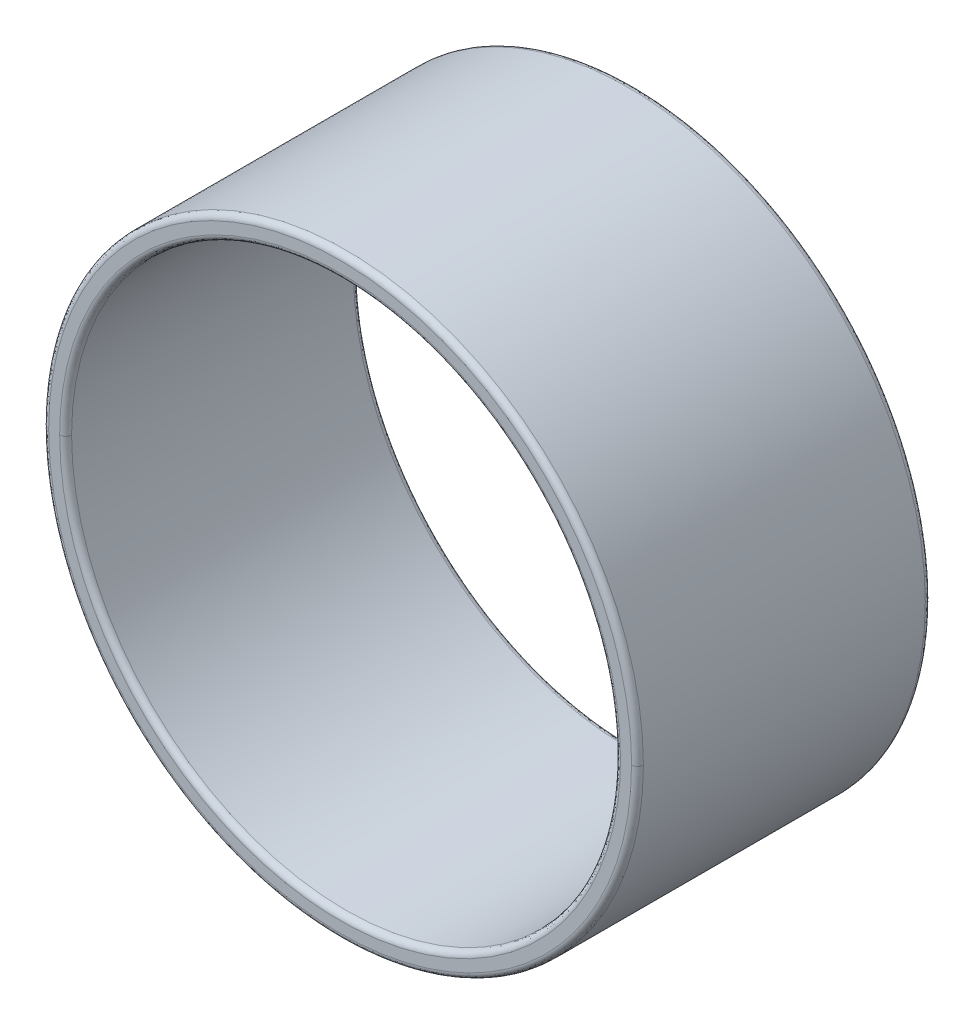
ISO-10303-21;
HEADER;
FILE_DESCRIPTION(('STEP AP214'),'2;1');
FILE_NAME('part.step','',(''),(''),'','','');
FILE_SCHEMA(('AUTOMOTIVE_DESIGN { 1 0 10303 214 1 1 1 1 }'));
ENDSEC;
DATA;
#1=APPLICATION_CONTEXT('core data for automotive mechanical design processes');
#2=APPLICATION_PROTOCOL_DEFINITION('international standard','automotive_design',2000,#1);
#3=PRODUCT_CONTEXT('',#1,'mechanical');
#4=PRODUCT('Part','Part','',(#3));
#5=PRODUCT_RELATED_PRODUCT_CATEGORY('part','',(#4));
#6=PRODUCT_DEFINITION_FORMATION('','',#4);
#7=PRODUCT_DEFINITION_CONTEXT('part definition',#1,'design');
#8=PRODUCT_DEFINITION('design','',#6,#7);
#9=PRODUCT_DEFINITION_SHAPE('','',#8);
#10=(LENGTH_UNIT() NAMED_UNIT(*) SI_UNIT(.MILLI.,.METRE.));
#11=(NAMED_UNIT(*) PLANE_ANGLE_UNIT() SI_UNIT($,.RADIAN.));
#12=(NAMED_UNIT(*) SI_UNIT($,.STERADIAN.) SOLID_ANGLE_UNIT());
#13=UNCERTAINTY_MEASURE_WITH_UNIT(LENGTH_MEASURE(1.E-05),#10,'distance_accuracy_value','');
#14=(GEOMETRIC_REPRESENTATION_CONTEXT(3) GLOBAL_UNCERTAINTY_ASSIGNED_CONTEXT((#13)) GLOBAL_UNIT_ASSIGNED_CONTEXT((#10,
#11,#12)) REPRESENTATION_CONTEXT('',''));
#15=CARTESIAN_POINT('',(0.,0.,0.));
#16=DIRECTION('',(0.,0.,1.));
#17=DIRECTION('',(1.,0.,0.));
#18=AXIS2_PLACEMENT_3D('',#15,#16,#17);
#19=CARTESIAN_POINT('',(38.104124071,0.,0.9079124844));
#20=CARTESIAN_POINT('',(38.104124071,-76.2082481166,0.9079124844));
#21=CARTESIAN_POINT('',(-38.104124071,-76.2082481166,0.9079124844));
#22=CARTESIAN_POINT('',(-38.104124071,0.,0.9079124844));
#23=CARTESIAN_POINT('',(38.0478115344,0.,0.3466656262));
#24=CARTESIAN_POINT('',(38.0478115344,-76.0956230942,0.3466656262));
#25=CARTESIAN_POINT('',(-38.0478115344,-76.0956230942,0.3466656262));
#26=CARTESIAN_POINT('',(-38.0478115344,0.,0.3466656262));
#27=CARTESIAN_POINT('',(38.4466656262,0.,-0.0521884656));
#28=CARTESIAN_POINT('',(38.4466656262,-76.893331227,-0.0521884656));
#29=CARTESIAN_POINT('',(-38.4466656262,-76.893331227,-0.0521884656));
#30=CARTESIAN_POINT('',(-38.4466656262,0.,-0.0521884656));
#31=CARTESIAN_POINT('',(39.0079124844,0.,0.004124071));
#32=CARTESIAN_POINT('',(39.0079124844,-78.0158249688,0.004124071));
#33=CARTESIAN_POINT('',(-39.0079124844,-78.0158249688,0.004124071));
#34=CARTESIAN_POINT('',(-39.0079124844,0.,0.004124071));
#35=(BOUNDED_SURFACE() B_SPLINE_SURFACE(3,3,((#19,#20,#21,#22),(#23,#24,#25,#26),(#27,#28,#29,
#30),(#31,#32,#33,#34)),.UNSPECIFIED.,.F.,.F.,.F.) B_SPLINE_SURFACE_WITH_KNOTS((4,4),(4,4),(0.,
1.),(0.,1.),.UNSPECIFIED.) GEOMETRIC_REPRESENTATION_ITEM() RATIONAL_B_SPLINE_SURFACE(((1.,
0.333333333333333,0.333333333333333,1.),(0.755320871117973,0.251773623705991,0.251773623705991,
0.755320871117973),(0.755320871117973,0.251773623705991,0.251773623705991,0.755320871117973),
(1.,0.333333333333333,0.333333333333333,1.))) REPRESENTATION_ITEM('') SURFACE());
#36=CARTESIAN_POINT('',(-38.104124071,0.,0.9079124844));
#37=CARTESIAN_POINT('',(-38.0478115344,0.,0.3466656262));
#38=CARTESIAN_POINT('',(-38.4466656262,0.,-0.0521884656));
#39=CARTESIAN_POINT('',(-39.0079124844,0.,0.004124071));
#40=(BOUNDED_CURVE() B_SPLINE_CURVE(3,(#36,#37,#38,#39),.UNSPECIFIED.,.F.,
.F.) B_SPLINE_CURVE_WITH_KNOTS((4,4),(0.,1.),
.UNSPECIFIED.) CURVE() GEOMETRIC_REPRESENTATION_ITEM() RATIONAL_B_SPLINE_CURVE((1.,
0.755320871117973,0.755320871117973,1.)) REPRESENTATION_ITEM(''));
#41=CARTESIAN_POINT('',(-38.1000000018308,-1.17216609396512E-08,0.8255));
#42=VERTEX_POINT('',#41);
#43=CARTESIAN_POINT('',(-38.9255000068731,0.,4.39397398410486E-09));
#44=VERTEX_POINT('',#43);
#45=EDGE_CURVE('E83',#42,#44,#40,.T.);
#46=CARTESIAN_POINT('',(0.,0.,0.8255));
#47=DIRECTION('',(0.,0.,1.));
#48=DIRECTION('',(1.,0.,0.));
#49=AXIS2_PLACEMENT_3D('',#46,#47,#48);
#50=CIRCLE('',#49,38.1);
#51=CARTESIAN_POINT('',(38.1000000018308,0.,0.82549999997455));
#52=VERTEX_POINT('',#51);
#53=EDGE_CURVE('E78',#52,#42,#50,.F.);
#54=CARTESIAN_POINT('',(38.104124071,0.,0.9079124844));
#55=CARTESIAN_POINT('',(38.0478115344,0.,0.3466656262));
#56=CARTESIAN_POINT('',(38.4466656262,0.,-0.0521884656));
#57=CARTESIAN_POINT('',(39.0079124844,0.,0.004124071));
#58=(BOUNDED_CURVE() B_SPLINE_CURVE(3,(#54,#55,#56,#57),.UNSPECIFIED.,.F.,
.F.) B_SPLINE_CURVE_WITH_KNOTS((4,4),(0.,1.),
.UNSPECIFIED.) CURVE() GEOMETRIC_REPRESENTATION_ITEM() RATIONAL_B_SPLINE_CURVE((1.,
0.755320871117973,0.755320871117973,1.)) REPRESENTATION_ITEM(''));
#59=CARTESIAN_POINT('',(38.9255000068731,0.,4.39397398410486E-09));
#60=VERTEX_POINT('',#59);
#61=EDGE_CURVE('E80',#60,#52,#58,.F.);
#62=CARTESIAN_POINT('',(38.9255000006825,0.,7.32328998054894E-09));
#63=CARTESIAN_POINT('',(38.9255000006825,-77.8509999982486,7.3232899765963E-09));
#64=CARTESIAN_POINT('',(-38.9255000006825,-77.8509999982486,7.3232899765963E-09));
#65=CARTESIAN_POINT('',(-38.9255000006825,0.,7.32328998054894E-09));
#66=(BOUNDED_CURVE() B_SPLINE_CURVE(3,(#62,#63,#64,#65),.UNSPECIFIED.,.F.,
.F.) B_SPLINE_CURVE_WITH_KNOTS((4,4),(0.,1.),
.UNSPECIFIED.) CURVE() GEOMETRIC_REPRESENTATION_ITEM() RATIONAL_B_SPLINE_CURVE((0.956578302542457,
0.318859434180819,0.318859434180819,0.956578302542457)) REPRESENTATION_ITEM(''));
#67=EDGE_CURVE('E211',#44,#60,#66,.F.);
#68=ORIENTED_EDGE('',*,*,#45,.F.);
#69=ORIENTED_EDGE('',*,*,#53,.F.);
#70=ORIENTED_EDGE('',*,*,#61,.F.);
#71=ORIENTED_EDGE('',*,*,#67,.F.);
#72=EDGE_LOOP('',(#68,#69,#70,#71));
#73=FACE_BOUND('',#72,.T.);
#74=ADVANCED_FACE('F16',(#73),#35,.T.);
#75=CARTESIAN_POINT('',(-38.104124071,0.,0.9079124844));
#76=CARTESIAN_POINT('',(-38.104124071,76.2082481166,0.9079124844));
#77=CARTESIAN_POINT('',(38.104124071,76.2082481166,0.9079124844));
#78=CARTESIAN_POINT('',(38.104124071,0.,0.9079124844));
#79=CARTESIAN_POINT('',(-38.0478115344,0.,0.3466656262));
#80=CARTESIAN_POINT('',(-38.0478115344,76.0956230942,0.3466656262));
#81=CARTESIAN_POINT('',(38.0478115344,76.0956230942,0.3466656262));
#82=CARTESIAN_POINT('',(38.0478115344,0.,0.3466656262));
#83=CARTESIAN_POINT('',(-38.4466656262,0.,-0.0521884656));
#84=CARTESIAN_POINT('',(-38.4466656262,76.893331227,-0.0521884656));
#85=CARTESIAN_POINT('',(38.4466656262,76.893331227,-0.0521884656));
#86=CARTESIAN_POINT('',(38.4466656262,0.,-0.0521884656));
#87=CARTESIAN_POINT('',(-39.0079124844,0.,0.004124071));
#88=CARTESIAN_POINT('',(-39.0079124844,78.0158249688,0.004124071));
#89=CARTESIAN_POINT('',(39.0079124844,78.0158249688,0.004124071));
#90=CARTESIAN_POINT('',(39.0079124844,0.,0.004124071));
#91=(BOUNDED_SURFACE() B_SPLINE_SURFACE(3,3,((#75,#76,#77,#78),(#79,#80,#81,#82),(#83,#84,#85,
#86),(#87,#88,#89,#90)),.UNSPECIFIED.,.F.,.F.,.F.) B_SPLINE_SURFACE_WITH_KNOTS((4,4),(4,4),(0.,
1.),(0.,1.),.UNSPECIFIED.) GEOMETRIC_REPRESENTATION_ITEM() RATIONAL_B_SPLINE_SURFACE(((1.,
0.333333333333333,0.333333333333333,1.),(0.755320871117973,0.251773623705991,0.251773623705991,
0.755320871117973),(0.755320871117973,0.251773623705991,0.251773623705991,0.755320871117973),
(1.,0.333333333333333,0.333333333333333,1.))) REPRESENTATION_ITEM('') SURFACE());
#92=CARTESIAN_POINT('',(0.,0.,0.8255));
#93=DIRECTION('',(0.,0.,1.));
#94=DIRECTION('',(1.,0.,0.));
#95=AXIS2_PLACEMENT_3D('',#92,#93,#94);
#96=CIRCLE('',#95,38.1);
#97=EDGE_CURVE('E87',#42,#52,#96,.F.);
#98=CARTESIAN_POINT('',(-38.9255000006825,0.,7.32328997990436E-09));
#99=CARTESIAN_POINT('',(-38.9255000006825,77.8509999982486,7.32328997671319E-09));
#100=CARTESIAN_POINT('',(38.9255000006825,77.8509999982486,7.32328997671319E-09));
#101=CARTESIAN_POINT('',(38.9255000006825,0.,7.32328997990436E-09));
#102=(BOUNDED_CURVE() B_SPLINE_CURVE(3,(#98,#99,#100,#101),.UNSPECIFIED.,.F.,
.F.) B_SPLINE_CURVE_WITH_KNOTS((4,4),(0.,1.),
.UNSPECIFIED.) CURVE() GEOMETRIC_REPRESENTATION_ITEM() RATIONAL_B_SPLINE_CURVE((0.956578302542459,
0.318859434180819,0.318859434180819,0.956578302542459)) REPRESENTATION_ITEM(''));
#103=EDGE_CURVE('E88',#60,#44,#102,.F.);
#104=ORIENTED_EDGE('',*,*,#97,.F.);
#105=ORIENTED_EDGE('',*,*,#45,.T.);
#106=ORIENTED_EDGE('',*,*,#103,.F.);
#107=ORIENTED_EDGE('',*,*,#61,.T.);
#108=EDGE_LOOP('',(#104,#105,#106,#107));
#109=FACE_BOUND('',#108,.T.);
#110=ADVANCED_FACE('F91',(#109),#91,.T.);
#111=CARTESIAN_POINT('',(40.3670875156,0.,0.004124071));
#112=CARTESIAN_POINT('',(40.3670875156,-80.7341750312,0.004124071));
#113=CARTESIAN_POINT('',(-40.3670875156,-80.7341750312,0.004124071));
#114=CARTESIAN_POINT('',(-40.3670875156,0.,0.004124071));
#115=CARTESIAN_POINT('',(40.9283343738,0.,-0.0521884656));
#116=CARTESIAN_POINT('',(40.9283343738,-81.856668773,-0.0521884656));
#117=CARTESIAN_POINT('',(-40.9283343738,-81.856668773,-0.0521884656));
#118=CARTESIAN_POINT('',(-40.9283343738,0.,-0.0521884656));
#119=CARTESIAN_POINT('',(41.3271884656,0.,0.3466656262));
#120=CARTESIAN_POINT('',(41.3271884656,-82.6543769058,0.3466656262));
#121=CARTESIAN_POINT('',(-41.3271884656,-82.6543769058,0.3466656262));
#122=CARTESIAN_POINT('',(-41.3271884656,0.,0.3466656262));
#123=CARTESIAN_POINT('',(41.270875929,0.,0.9079124844));
#124=CARTESIAN_POINT('',(41.270875929,-82.5417518834,0.9079124844));
#125=CARTESIAN_POINT('',(-41.270875929,-82.5417518834,0.9079124844));
#126=CARTESIAN_POINT('',(-41.270875929,0.,0.9079124844));
#127=(BOUNDED_SURFACE() B_SPLINE_SURFACE(3,3,((#111,#112,#113,#114),(#115,#116,#117,#118),(#119,
#120,#121,#122),(#123,#124,#125,#126)),.UNSPECIFIED.,.F.,.F.,
.F.) B_SPLINE_SURFACE_WITH_KNOTS((4,4),(4,4),(0.,1.),(0.,1.),
.UNSPECIFIED.) GEOMETRIC_REPRESENTATION_ITEM() RATIONAL_B_SPLINE_SURFACE(((1.,0.333333333333333,
0.333333333333333,1.),(0.755320871117973,0.251773623705991,0.251773623705991,0.755320871117973),
(0.755320871117973,0.251773623705991,0.251773623705991,0.755320871117973),(1.,0.333333333333333,
0.333333333333333,1.))) REPRESENTATION_ITEM('') SURFACE());
#128=CARTESIAN_POINT('',(-40.3670875156,0.,0.004124071));
#129=CARTESIAN_POINT('',(-40.9283343738,0.,-0.0521884656));
#130=CARTESIAN_POINT('',(-41.3271884656,0.,0.3466656262));
#131=CARTESIAN_POINT('',(-41.270875929,0.,0.9079124844));
#132=(BOUNDED_CURVE() B_SPLINE_CURVE(3,(#128,#129,#130,#131),.UNSPECIFIED.,.F.,
.F.) B_SPLINE_CURVE_WITH_KNOTS((4,4),(0.,1.),
.UNSPECIFIED.) CURVE() GEOMETRIC_REPRESENTATION_ITEM() RATIONAL_B_SPLINE_CURVE((1.,
0.755320871117973,0.755320871117973,1.)) REPRESENTATION_ITEM(''));
#133=CARTESIAN_POINT('',(-41.2749999963384,-8.46564401197029E-09,0.825499999955463));
#134=VERTEX_POINT('',#133);
#135=CARTESIAN_POINT('',(-40.4494999917222,0.,4.39397398430371E-09));
#136=VERTEX_POINT('',#135);
#137=EDGE_CURVE('E178',#134,#136,#132,.F.);
#138=CARTESIAN_POINT('',(-40.4494999993175,0.,7.32328998017785E-09));
#139=CARTESIAN_POINT('',(-40.4494999993174,-80.8990000017513,7.32328997736993E-09));
#140=CARTESIAN_POINT('',(40.4494999993174,-80.8990000017513,7.32328997736993E-09));
#141=CARTESIAN_POINT('',(40.4494999993175,0.,7.32328998017785E-09));
#142=(BOUNDED_CURVE() B_SPLINE_CURVE(3,(#138,#139,#140,#141),.UNSPECIFIED.,.F.,
.F.) B_SPLINE_CURVE_WITH_KNOTS((4,4),(0.,1.),
.UNSPECIFIED.) CURVE() GEOMETRIC_REPRESENTATION_ITEM() RATIONAL_B_SPLINE_CURVE((0.956578302542472,
0.318859434180824,0.318859434180824,0.956578302542472)) REPRESENTATION_ITEM(''));
#143=CARTESIAN_POINT('',(40.4494999917222,0.,4.39397398430371E-09));
#144=VERTEX_POINT('',#143);
#145=EDGE_CURVE('E173',#144,#136,#142,.F.);
#146=CARTESIAN_POINT('',(40.3670875156,0.,0.004124071));
#147=CARTESIAN_POINT('',(40.9283343738,0.,-0.0521884656));
#148=CARTESIAN_POINT('',(41.3271884656,0.,0.3466656262));
#149=CARTESIAN_POINT('',(41.270875929,0.,0.9079124844));
#150=(BOUNDED_CURVE() B_SPLINE_CURVE(3,(#146,#147,#148,#149),.UNSPECIFIED.,.F.,
.F.) B_SPLINE_CURVE_WITH_KNOTS((4,4),(0.,1.),
.UNSPECIFIED.) CURVE() GEOMETRIC_REPRESENTATION_ITEM() RATIONAL_B_SPLINE_CURVE((1.,
0.755320871117973,0.755320871117973,1.)) REPRESENTATION_ITEM(''));
#151=CARTESIAN_POINT('',(41.2749999981692,-9.26558003451737E-10,0.825499999977731));
#152=VERTEX_POINT('',#151);
#153=EDGE_CURVE('E116',#144,#152,#150,.T.);
#154=CARTESIAN_POINT('',(0.,0.,0.8255));
#155=DIRECTION('',(0.,0.,1.));
#156=DIRECTION('',(1.,0.,0.));
#157=AXIS2_PLACEMENT_3D('',#154,#155,#156);
#158=CIRCLE('',#157,41.275);
#159=EDGE_CURVE('E98',#152,#134,#158,.F.);
#160=ORIENTED_EDGE('',*,*,#137,.T.);
#161=ORIENTED_EDGE('',*,*,#145,.F.);
#162=ORIENTED_EDGE('',*,*,#153,.T.);
#163=ORIENTED_EDGE('',*,*,#159,.T.);
#164=EDGE_LOOP('',(#160,#161,#162,#163));
#165=FACE_BOUND('',#164,.T.);
#166=ADVANCED_FACE('F140',(#165),#127,.T.);
#167=CARTESIAN_POINT('',(40.934894,-40.934894,0.));
#168=DIRECTION('',(0.,0.,-1.));
#169=DIRECTION('',(-1.,0.,0.));
#170=AXIS2_PLACEMENT_3D('',#167,#168,#169);
#171=PLANE('',#170);
#172=ORIENTED_EDGE('',*,*,#67,.T.);
#173=ORIENTED_EDGE('',*,*,#103,.T.);
#174=EDGE_LOOP('',(#172,#173));
#175=FACE_BOUND('',#174,.T.);
#176=CARTESIAN_POINT('',(40.4494999993175,0.,7.3232899798537E-09));
#177=CARTESIAN_POINT('',(40.4494999993175,80.8990000017513,7.32328997698987E-09));
#178=CARTESIAN_POINT('',(-40.4494999993175,80.8990000017513,7.32328997698987E-09));
#179=CARTESIAN_POINT('',(-40.4494999993175,0.,7.3232899798537E-09));
#180=(BOUNDED_CURVE() B_SPLINE_CURVE(3,(#176,#177,#178,#179),.UNSPECIFIED.,.F.,
.F.) B_SPLINE_CURVE_WITH_KNOTS((4,4),(0.,1.),
.UNSPECIFIED.) CURVE() GEOMETRIC_REPRESENTATION_ITEM() RATIONAL_B_SPLINE_CURVE((0.956578302542472,
0.318859434180824,0.318859434180824,0.956578302542472)) REPRESENTATION_ITEM(''));
#181=EDGE_CURVE('E101',#144,#136,#180,.T.);
#182=ORIENTED_EDGE('',*,*,#181,.F.);
#183=ORIENTED_EDGE('',*,*,#145,.T.);
#184=EDGE_LOOP('',(#182,#183));
#185=FACE_BOUND('',#184,.T.);
#186=ADVANCED_FACE('F154',(#175,#185),#171,.T.);
#187=CARTESIAN_POINT('',(0.,0.,0.8255));
#188=DIRECTION('',(0.,0.,1.));
#189=DIRECTION('',(0.,-1.,0.));
#190=AXIS2_PLACEMENT_3D('',#187,#188,#189);
#191=CYLINDRICAL_SURFACE('',#190,38.1);
#192=ORIENTED_EDGE('',*,*,#53,.T.);
#193=ORIENTED_EDGE('',*,*,#97,.T.);
#194=EDGE_LOOP('',(#192,#193));
#195=FACE_BOUND('',#194,.T.);
#196=CARTESIAN_POINT('',(0.,0.,39.9544999995018));
#197=DIRECTION('',(0.,0.,-1.));
#198=DIRECTION('',(0.,1.,0.));
#199=AXIS2_PLACEMENT_3D('',#196,#197,#198);
#200=CIRCLE('',#199,38.1000000073233);
#201=CARTESIAN_POINT('',(-38.1000000054925,-3.90722031321706E-09,39.9544999995018));
#202=VERTEX_POINT('',#201);
#203=CARTESIAN_POINT('',(38.1000000054925,0.,39.9544999994764));
#204=VERTEX_POINT('',#203);
#205=EDGE_CURVE('E344',#202,#204,#200,.T.);
#206=ORIENTED_EDGE('',*,*,#205,.F.);
#207=CARTESIAN_POINT('',(0.,0.,39.9544999995018));
#208=DIRECTION('',(0.,0.,-1.));
#209=DIRECTION('',(0.,1.,0.));
#210=AXIS2_PLACEMENT_3D('',#207,#208,#209);
#211=CIRCLE('',#210,38.1000000073233);
#212=EDGE_CURVE('E355',#204,#202,#211,.T.);
#213=ORIENTED_EDGE('',*,*,#212,.F.);
#214=EDGE_LOOP('',(#206,#213));
#215=FACE_BOUND('',#214,.T.);
#216=ADVANCED_FACE('F96',(#195,#215),#191,.F.);
#217=CARTESIAN_POINT('',(-40.3670875156,0.,0.004124071));
#218=CARTESIAN_POINT('',(-40.3670875156,80.7341750312,0.004124071));
#219=CARTESIAN_POINT('',(40.3670875156,80.7341750312,0.004124071));
#220=CARTESIAN_POINT('',(40.3670875156,0.,0.004124071));
#221=CARTESIAN_POINT('',(-40.9283343738,0.,-0.0521884656));
#222=CARTESIAN_POINT('',(-40.9283343738,81.856668773,-0.0521884656));
#223=CARTESIAN_POINT('',(40.9283343738,81.856668773,-0.0521884656));
#224=CARTESIAN_POINT('',(40.9283343738,0.,-0.0521884656));
#225=CARTESIAN_POINT('',(-41.3271884656,0.,0.3466656262));
#226=CARTESIAN_POINT('',(-41.3271884656,82.6543769058,0.3466656262));
#227=CARTESIAN_POINT('',(41.3271884656,82.6543769058,0.3466656262));
#228=CARTESIAN_POINT('',(41.3271884656,0.,0.3466656262));
#229=CARTESIAN_POINT('',(-41.270875929,0.,0.9079124844));
#230=CARTESIAN_POINT('',(-41.270875929,82.5417518834,0.9079124844));
#231=CARTESIAN_POINT('',(41.270875929,82.5417518834,0.9079124844));
#232=CARTESIAN_POINT('',(41.270875929,0.,0.9079124844));
#233=(BOUNDED_SURFACE() B_SPLINE_SURFACE(3,3,((#217,#218,#219,#220),(#221,#222,#223,#224),(#225,
#226,#227,#228),(#229,#230,#231,#232)),.UNSPECIFIED.,.F.,.F.,
.F.) B_SPLINE_SURFACE_WITH_KNOTS((4,4),(4,4),(0.,1.),(0.,1.),
.UNSPECIFIED.) GEOMETRIC_REPRESENTATION_ITEM() RATIONAL_B_SPLINE_SURFACE(((1.,0.333333333333333,
0.333333333333333,1.),(0.755320871117973,0.251773623705991,0.251773623705991,0.755320871117973),
(0.755320871117973,0.251773623705991,0.251773623705991,0.755320871117973),(1.,0.333333333333333,
0.333333333333333,1.))) REPRESENTATION_ITEM('') SURFACE());
#234=CARTESIAN_POINT('',(0.,0.,0.8255));
#235=DIRECTION('',(0.,0.,1.));
#236=DIRECTION('',(1.,0.,0.));
#237=AXIS2_PLACEMENT_3D('',#234,#235,#236);
#238=CIRCLE('',#237,41.275);
#239=EDGE_CURVE('E202',#134,#152,#238,.F.);
#240=ORIENTED_EDGE('',*,*,#181,.T.);
#241=ORIENTED_EDGE('',*,*,#137,.F.);
#242=ORIENTED_EDGE('',*,*,#239,.T.);
#243=ORIENTED_EDGE('',*,*,#153,.F.);
#244=EDGE_LOOP('',(#240,#241,#242,#243));
#245=FACE_BOUND('',#244,.T.);
#246=ADVANCED_FACE('F390',(#245),#233,.T.);
#247=CARTESIAN_POINT('',(-40.3670875156,0.,40.7758759284));
#248=CARTESIAN_POINT('',(-40.3670875156,-80.7341750312,40.7758759284));
#249=CARTESIAN_POINT('',(40.3670875156,-80.7341750312,40.7758759284));
#250=CARTESIAN_POINT('',(40.3670875156,0.,40.7758759284));
#251=CARTESIAN_POINT('',(-40.9283343738,0.,40.832188465));
#252=CARTESIAN_POINT('',(-40.9283343738,-81.856668773,40.832188465));
#253=CARTESIAN_POINT('',(40.9283343738,-81.856668773,40.832188465));
#254=CARTESIAN_POINT('',(40.9283343738,0.,40.832188465));
#255=CARTESIAN_POINT('',(-41.3271884656,0.,40.4333343732));
#256=CARTESIAN_POINT('',(-41.3271884656,-82.6543769058,40.4333343732));
#257=CARTESIAN_POINT('',(41.3271884656,-82.6543769058,40.4333343732));
#258=CARTESIAN_POINT('',(41.3271884656,0.,40.4333343732));
#259=CARTESIAN_POINT('',(-41.270875929,0.,39.872087515));
#260=CARTESIAN_POINT('',(-41.270875929,-82.5417518834,39.872087515));
#261=CARTESIAN_POINT('',(41.270875929,-82.5417518834,39.872087515));
#262=CARTESIAN_POINT('',(41.270875929,0.,39.872087515));
#263=(BOUNDED_SURFACE() B_SPLINE_SURFACE(3,3,((#247,#248,#249,#250),(#251,#252,#253,#254),(#255,
#256,#257,#258),(#259,#260,#261,#262)),.UNSPECIFIED.,.F.,.F.,
.F.) B_SPLINE_SURFACE_WITH_KNOTS((4,4),(4,4),(0.,1.),(0.,1.),
.UNSPECIFIED.) GEOMETRIC_REPRESENTATION_ITEM() RATIONAL_B_SPLINE_SURFACE(((1.,0.333333333333333,
0.333333333333333,1.),(0.755320871117973,0.251773623705991,0.251773623705991,0.755320871117973),
(0.755320871117973,0.251773623705991,0.251773623705991,0.755320871117973),(1.,0.333333333333333,
0.333333333333333,1.))) REPRESENTATION_ITEM('') SURFACE());
#264=CARTESIAN_POINT('',(40.3670875156,0.,40.7758759284));
#265=CARTESIAN_POINT('',(40.9283343738,0.,40.832188465));
#266=CARTESIAN_POINT('',(41.3271884656,0.,40.4333343732));
#267=CARTESIAN_POINT('',(41.270875929,0.,39.872087515));
#268=(BOUNDED_CURVE() B_SPLINE_CURVE(3,(#264,#265,#266,#267),.UNSPECIFIED.,.F.,
.F.) B_SPLINE_CURVE_WITH_KNOTS((4,4),(0.,1.),
.UNSPECIFIED.) CURVE() GEOMETRIC_REPRESENTATION_ITEM() RATIONAL_B_SPLINE_CURVE((1.,
0.755320871117973,0.755320871117973,1.)) REPRESENTATION_ITEM(''));
#269=CARTESIAN_POINT('',(41.2749999945075,0.,39.9544999995018));
#270=VERTEX_POINT('',#269);
#271=CARTESIAN_POINT('',(40.4494999917222,0.,40.779999995006));
#272=VERTEX_POINT('',#271);
#273=EDGE_CURVE('E36',#270,#272,#268,.F.);
#274=CARTESIAN_POINT('',(40.4494999993175,0.,40.7799999920767));
#275=CARTESIAN_POINT('',(40.4494999993174,-80.8990000017513,40.7799999920767));
#276=CARTESIAN_POINT('',(-40.4494999993174,-80.8990000017513,40.7799999920767));
#277=CARTESIAN_POINT('',(-40.4494999993175,0.,40.7799999920767));
#278=(BOUNDED_CURVE() B_SPLINE_CURVE(3,(#274,#275,#276,#277),.UNSPECIFIED.,.F.,
.F.) B_SPLINE_CURVE_WITH_KNOTS((4,4),(0.,1.),
.UNSPECIFIED.) CURVE() GEOMETRIC_REPRESENTATION_ITEM() RATIONAL_B_SPLINE_CURVE((0.956578302542475,
0.318859434180825,0.318859434180825,0.956578302542475)) REPRESENTATION_ITEM(''));
#279=CARTESIAN_POINT('',(-40.4494999917222,0.,40.779999995006));
#280=VERTEX_POINT('',#279);
#281=EDGE_CURVE('E205',#280,#272,#278,.F.);
#282=CARTESIAN_POINT('',(-40.3670875156,0.,40.7758759284));
#283=CARTESIAN_POINT('',(-40.9283343738,0.,40.832188465));
#284=CARTESIAN_POINT('',(-41.3271884656,0.,40.4333343732));
#285=CARTESIAN_POINT('',(-41.270875929,0.,39.872087515));
#286=(BOUNDED_CURVE() B_SPLINE_CURVE(3,(#282,#283,#284,#285),.UNSPECIFIED.,.F.,
.F.) B_SPLINE_CURVE_WITH_KNOTS((4,4),(0.,1.),
.UNSPECIFIED.) CURVE() GEOMETRIC_REPRESENTATION_ITEM() RATIONAL_B_SPLINE_CURVE((1.,
0.755320871117973,0.755320871117973,1.)) REPRESENTATION_ITEM(''));
#287=CARTESIAN_POINT('',(-41.2749999945075,-7.40743851005156E-09,39.9544999995018));
#288=VERTEX_POINT('',#287);
#289=EDGE_CURVE('E291',#280,#288,#286,.T.);
#290=CARTESIAN_POINT('',(0.,0.,39.9544999995018));
#291=DIRECTION('',(0.,0.,1.));
#292=DIRECTION('',(1.,0.,0.));
#293=AXIS2_PLACEMENT_3D('',#290,#291,#292);
#294=CIRCLE('',#293,41.2749999926767);
#295=EDGE_CURVE('E418',#288,#270,#294,.T.);
#296=ORIENTED_EDGE('',*,*,#273,.T.);
#297=ORIENTED_EDGE('',*,*,#281,.F.);
#298=ORIENTED_EDGE('',*,*,#289,.T.);
#299=ORIENTED_EDGE('',*,*,#295,.T.);
#300=EDGE_LOOP('',(#296,#297,#298,#299));
#301=FACE_BOUND('',#300,.T.);
#302=ADVANCED_FACE('F379',(#301),#263,.T.);
#303=CARTESIAN_POINT('',(-38.104124071,0.,39.872087515));
#304=CARTESIAN_POINT('',(-38.104124071,-76.2082481166,39.872087515));
#305=CARTESIAN_POINT('',(38.104124071,-76.2082481166,39.872087515));
#306=CARTESIAN_POINT('',(38.104124071,0.,39.872087515));
#307=CARTESIAN_POINT('',(-38.0478115344,0.,40.4333343732));
#308=CARTESIAN_POINT('',(-38.0478115344,-76.0956230942,40.4333343732));
#309=CARTESIAN_POINT('',(38.0478115344,-76.0956230942,40.4333343732));
#310=CARTESIAN_POINT('',(38.0478115344,0.,40.4333343732));
#311=CARTESIAN_POINT('',(-38.4466656262,0.,40.832188465));
#312=CARTESIAN_POINT('',(-38.4466656262,-76.893331227,40.832188465));
#313=CARTESIAN_POINT('',(38.4466656262,-76.893331227,40.832188465));
#314=CARTESIAN_POINT('',(38.4466656262,0.,40.832188465));
#315=CARTESIAN_POINT('',(-39.0079124844,0.,40.7758759284));
#316=CARTESIAN_POINT('',(-39.0079124844,-78.0158249688,40.7758759284));
#317=CARTESIAN_POINT('',(39.0079124844,-78.0158249688,40.7758759284));
#318=CARTESIAN_POINT('',(39.0079124844,0.,40.7758759284));
#319=(BOUNDED_SURFACE() B_SPLINE_SURFACE(3,3,((#303,#304,#305,#306),(#307,#308,#309,#310),(#311,
#312,#313,#314),(#315,#316,#317,#318)),.UNSPECIFIED.,.F.,.F.,
.F.) B_SPLINE_SURFACE_WITH_KNOTS((4,4),(4,4),(0.,1.),(0.,1.),
.UNSPECIFIED.) GEOMETRIC_REPRESENTATION_ITEM() RATIONAL_B_SPLINE_SURFACE(((1.,0.333333333333333,
0.333333333333333,1.),(0.755320871117973,0.251773623705991,0.251773623705991,0.755320871117973),
(0.755320871117973,0.251773623705991,0.251773623705991,0.755320871117973),(1.,0.333333333333333,
0.333333333333333,1.))) REPRESENTATION_ITEM('') SURFACE());
#320=CARTESIAN_POINT('',(38.104124071,0.,39.872087515));
#321=CARTESIAN_POINT('',(38.0478115344,0.,40.4333343732));
#322=CARTESIAN_POINT('',(38.4466656262,0.,40.832188465));
#323=CARTESIAN_POINT('',(39.0079124844,0.,40.7758759284));
#324=(BOUNDED_CURVE() B_SPLINE_CURVE(3,(#320,#321,#322,#323),.UNSPECIFIED.,.F.,
.F.) B_SPLINE_CURVE_WITH_KNOTS((4,4),(0.,1.),
.UNSPECIFIED.) CURVE() GEOMETRIC_REPRESENTATION_ITEM() RATIONAL_B_SPLINE_CURVE((1.,
0.755320871117973,0.755320871117973,1.)) REPRESENTATION_ITEM(''));
#325=CARTESIAN_POINT('',(38.9255000068731,0.,40.779999995006));
#326=VERTEX_POINT('',#325);
#327=EDGE_CURVE('E206',#204,#326,#324,.T.);
#328=CARTESIAN_POINT('',(-38.104124071,0.,39.872087515));
#329=CARTESIAN_POINT('',(-38.0478115344,0.,40.4333343732));
#330=CARTESIAN_POINT('',(-38.4466656262,0.,40.832188465));
#331=CARTESIAN_POINT('',(-39.0079124844,0.,40.7758759284));
#332=(BOUNDED_CURVE() B_SPLINE_CURVE(3,(#328,#329,#330,#331),.UNSPECIFIED.,.F.,
.F.) B_SPLINE_CURVE_WITH_KNOTS((4,4),(0.,1.),
.UNSPECIFIED.) CURVE() GEOMETRIC_REPRESENTATION_ITEM() RATIONAL_B_SPLINE_CURVE((1.,
0.755320871117973,0.755320871117973,1.)) REPRESENTATION_ITEM(''));
#333=CARTESIAN_POINT('',(-38.9255000068731,0.,40.779999995006));
#334=VERTEX_POINT('',#333);
#335=EDGE_CURVE('E349',#334,#202,#332,.F.);
#336=CARTESIAN_POINT('',(-38.9255000006825,0.,40.7799999920767));
#337=CARTESIAN_POINT('',(-38.9255000006825,-77.8509999982486,40.7799999920767));
#338=CARTESIAN_POINT('',(38.9255000006825,-77.8509999982486,40.7799999920767));
#339=CARTESIAN_POINT('',(38.9255000006825,0.,40.7799999920767));
#340=(BOUNDED_CURVE() B_SPLINE_CURVE(3,(#336,#337,#338,#339),.UNSPECIFIED.,.F.,
.F.) B_SPLINE_CURVE_WITH_KNOTS((4,4),(0.,1.),
.UNSPECIFIED.) CURVE() GEOMETRIC_REPRESENTATION_ITEM() RATIONAL_B_SPLINE_CURVE((0.956578302542463,
0.318859434180821,0.318859434180821,0.956578302542463)) REPRESENTATION_ITEM(''));
#341=EDGE_CURVE('E254',#326,#334,#340,.F.);
#342=ORIENTED_EDGE('',*,*,#327,.F.);
#343=ORIENTED_EDGE('',*,*,#212,.T.);
#344=ORIENTED_EDGE('',*,*,#335,.F.);
#345=ORIENTED_EDGE('',*,*,#341,.F.);
#346=EDGE_LOOP('',(#342,#343,#344,#345));
#347=FACE_BOUND('',#346,.T.);
#348=ADVANCED_FACE('F323',(#347),#319,.T.);
#349=CARTESIAN_POINT('',(38.104124071,0.,39.872087515));
#350=CARTESIAN_POINT('',(38.104124071,76.2082481166,39.872087515));
#351=CARTESIAN_POINT('',(-38.104124071,76.2082481166,39.872087515));
#352=CARTESIAN_POINT('',(-38.104124071,0.,39.872087515));
#353=CARTESIAN_POINT('',(38.0478115344,0.,40.4333343732));
#354=CARTESIAN_POINT('',(38.0478115344,76.0956230942,40.4333343732));
#355=CARTESIAN_POINT('',(-38.0478115344,76.0956230942,40.4333343732));
#356=CARTESIAN_POINT('',(-38.0478115344,0.,40.4333343732));
#357=CARTESIAN_POINT('',(38.4466656262,0.,40.832188465));
#358=CARTESIAN_POINT('',(38.4466656262,76.893331227,40.832188465));
#359=CARTESIAN_POINT('',(-38.4466656262,76.893331227,40.832188465));
#360=CARTESIAN_POINT('',(-38.4466656262,0.,40.832188465));
#361=CARTESIAN_POINT('',(39.0079124844,0.,40.7758759284));
#362=CARTESIAN_POINT('',(39.0079124844,78.0158249688,40.7758759284));
#363=CARTESIAN_POINT('',(-39.0079124844,78.0158249688,40.7758759284));
#364=CARTESIAN_POINT('',(-39.0079124844,0.,40.7758759284));
#365=(BOUNDED_SURFACE() B_SPLINE_SURFACE(3,3,((#349,#350,#351,#352),(#353,#354,#355,#356),(#357,
#358,#359,#360),(#361,#362,#363,#364)),.UNSPECIFIED.,.F.,.F.,
.F.) B_SPLINE_SURFACE_WITH_KNOTS((4,4),(4,4),(0.,1.),(0.,1.),
.UNSPECIFIED.) GEOMETRIC_REPRESENTATION_ITEM() RATIONAL_B_SPLINE_SURFACE(((1.,0.333333333333333,
0.333333333333333,1.),(0.755320871117973,0.251773623705991,0.251773623705991,0.755320871117973),
(0.755320871117973,0.251773623705991,0.251773623705991,0.755320871117973),(1.,0.333333333333333,
0.333333333333333,1.))) REPRESENTATION_ITEM('') SURFACE());
#366=CARTESIAN_POINT('',(38.9255000006825,0.,40.7799999920767));
#367=CARTESIAN_POINT('',(38.9255000006825,77.8509999982486,40.7799999920767));
#368=CARTESIAN_POINT('',(-38.9255000006825,77.8509999982486,40.7799999920767));
#369=CARTESIAN_POINT('',(-38.9255000006825,0.,40.7799999920767));
#370=(BOUNDED_CURVE() B_SPLINE_CURVE(3,(#366,#367,#368,#369),.UNSPECIFIED.,.F.,
.F.) B_SPLINE_CURVE_WITH_KNOTS((4,4),(0.,1.),
.UNSPECIFIED.) CURVE() GEOMETRIC_REPRESENTATION_ITEM() RATIONAL_B_SPLINE_CURVE((0.956578302542464,
0.318859434180821,0.318859434180821,0.956578302542464)) REPRESENTATION_ITEM(''));
#371=EDGE_CURVE('E265',#334,#326,#370,.F.);
#372=ORIENTED_EDGE('',*,*,#205,.T.);
#373=ORIENTED_EDGE('',*,*,#327,.T.);
#374=ORIENTED_EDGE('',*,*,#371,.F.);
#375=ORIENTED_EDGE('',*,*,#335,.T.);
#376=EDGE_LOOP('',(#372,#373,#374,#375));
#377=FACE_BOUND('',#376,.T.);
#378=ADVANCED_FACE('F316',(#377),#365,.T.);
#379=CARTESIAN_POINT('',(0.,0.,0.8255));
#380=DIRECTION('',(0.,0.,1.));
#381=DIRECTION('',(0.,-1.,0.));
#382=AXIS2_PLACEMENT_3D('',#379,#380,#381);
#383=CYLINDRICAL_SURFACE('',#382,41.275);
#384=CARTESIAN_POINT('',(0.,0.,39.9544999995018));
#385=DIRECTION('',(0.,0.,1.));
#386=DIRECTION('',(1.,0.,0.));
#387=AXIS2_PLACEMENT_3D('',#384,#385,#386);
#388=CIRCLE('',#387,41.2749999926767);
#389=EDGE_CURVE('E28',#270,#288,#388,.T.);
#390=ORIENTED_EDGE('',*,*,#389,.F.);
#391=ORIENTED_EDGE('',*,*,#295,.F.);
#392=EDGE_LOOP('',(#390,#391));
#393=FACE_BOUND('',#392,.T.);
#394=ORIENTED_EDGE('',*,*,#239,.F.);
#395=ORIENTED_EDGE('',*,*,#159,.F.);
#396=EDGE_LOOP('',(#394,#395));
#397=FACE_BOUND('',#396,.T.);
#398=ADVANCED_FACE('F308',(#393,#397),#383,.T.);
#399=CARTESIAN_POINT('',(-40.934894,-40.934894,40.7799999994));
#400=DIRECTION('',(0.,0.,1.));
#401=DIRECTION('',(1.,0.,0.));
#402=AXIS2_PLACEMENT_3D('',#399,#400,#401);
#403=PLANE('',#402);
#404=ORIENTED_EDGE('',*,*,#341,.T.);
#405=ORIENTED_EDGE('',*,*,#371,.T.);
#406=EDGE_LOOP('',(#404,#405));
#407=FACE_BOUND('',#406,.T.);
#408=CARTESIAN_POINT('',(-40.4494999993174,0.,40.7799999920767));
#409=CARTESIAN_POINT('',(-40.4494999993175,80.8990000017513,40.7799999920767));
#410=CARTESIAN_POINT('',(40.4494999993175,80.8990000017513,40.7799999920767));
#411=CARTESIAN_POINT('',(40.4494999993174,0.,40.7799999920767));
#412=(BOUNDED_CURVE() B_SPLINE_CURVE(3,(#408,#409,#410,#411),.UNSPECIFIED.,.F.,
.F.) B_SPLINE_CURVE_WITH_KNOTS((4,4),(0.,1.),
.UNSPECIFIED.) CURVE() GEOMETRIC_REPRESENTATION_ITEM() RATIONAL_B_SPLINE_CURVE((0.956578302542476,
0.318859434180825,0.318859434180825,0.956578302542476)) REPRESENTATION_ITEM(''));
#413=EDGE_CURVE('E11',#280,#272,#412,.T.);
#414=ORIENTED_EDGE('',*,*,#413,.F.);
#415=ORIENTED_EDGE('',*,*,#281,.T.);
#416=EDGE_LOOP('',(#414,#415));
#417=FACE_BOUND('',#416,.T.);
#418=ADVANCED_FACE('F18',(#407,#417),#403,.T.);
#419=CARTESIAN_POINT('',(40.3670875156,0.,40.7758759284));
#420=CARTESIAN_POINT('',(40.3670875156,80.7341750312,40.7758759284));
#421=CARTESIAN_POINT('',(-40.3670875156,80.7341750312,40.7758759284));
#422=CARTESIAN_POINT('',(-40.3670875156,0.,40.7758759284));
#423=CARTESIAN_POINT('',(40.9283343738,0.,40.832188465));
#424=CARTESIAN_POINT('',(40.9283343738,81.856668773,40.832188465));
#425=CARTESIAN_POINT('',(-40.9283343738,81.856668773,40.832188465));
#426=CARTESIAN_POINT('',(-40.9283343738,0.,40.832188465));
#427=CARTESIAN_POINT('',(41.3271884656,0.,40.4333343732));
#428=CARTESIAN_POINT('',(41.3271884656,82.6543769058,40.4333343732));
#429=CARTESIAN_POINT('',(-41.3271884656,82.6543769058,40.4333343732));
#430=CARTESIAN_POINT('',(-41.3271884656,0.,40.4333343732));
#431=CARTESIAN_POINT('',(41.270875929,0.,39.872087515));
#432=CARTESIAN_POINT('',(41.270875929,82.5417518834,39.872087515));
#433=CARTESIAN_POINT('',(-41.270875929,82.5417518834,39.872087515));
#434=CARTESIAN_POINT('',(-41.270875929,0.,39.872087515));
#435=(BOUNDED_SURFACE() B_SPLINE_SURFACE(3,3,((#419,#420,#421,#422),(#423,#424,#425,#426),(#427,
#428,#429,#430),(#431,#432,#433,#434)),.UNSPECIFIED.,.F.,.F.,
.F.) B_SPLINE_SURFACE_WITH_KNOTS((4,4),(4,4),(0.,1.),(0.,1.),
.UNSPECIFIED.) GEOMETRIC_REPRESENTATION_ITEM() RATIONAL_B_SPLINE_SURFACE(((1.,0.333333333333333,
0.333333333333333,1.),(0.755320871117973,0.251773623705991,0.251773623705991,0.755320871117973),
(0.755320871117973,0.251773623705991,0.251773623705991,0.755320871117973),(1.,0.333333333333333,
0.333333333333333,1.))) REPRESENTATION_ITEM('') SURFACE());
#436=ORIENTED_EDGE('',*,*,#413,.T.);
#437=ORIENTED_EDGE('',*,*,#273,.F.);
#438=ORIENTED_EDGE('',*,*,#389,.T.);
#439=ORIENTED_EDGE('',*,*,#289,.F.);
#440=EDGE_LOOP('',(#436,#437,#438,#439));
#441=FACE_BOUND('',#440,.T.);
#442=ADVANCED_FACE('F288',(#441),#435,.T.);
#443=CLOSED_SHELL('',(#74,#110,#166,#186,#216,#246,#302,#348,#378,#398,#418,#442));
#444=MANIFOLD_SOLID_BREP('B1',#443);
#445=ADVANCED_BREP_SHAPE_REPRESENTATION('',(#18,#444),#14);
#446=SHAPE_DEFINITION_REPRESENTATION(#9,#445);
ENDSEC;
END-ISO-10303-21;
